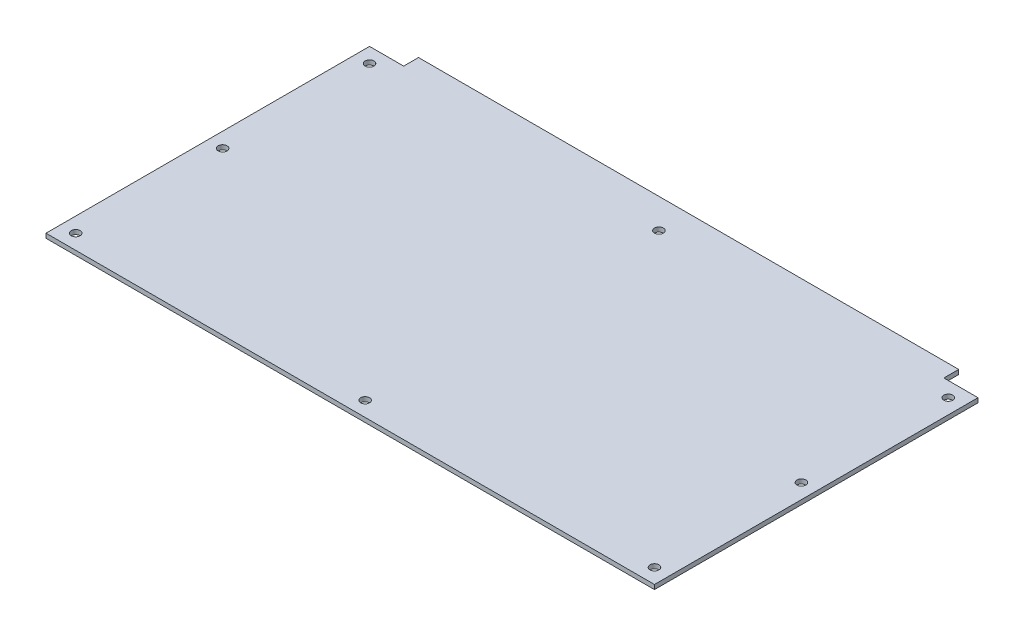
ISO-10303-21;
HEADER;
FILE_DESCRIPTION(('STEP AP214'),'2;1');
FILE_NAME('part.step','',(''),(''),'','','');
FILE_SCHEMA(('AUTOMOTIVE_DESIGN { 1 0 10303 214 1 1 1 1 }'));
ENDSEC;
DATA;
#1=APPLICATION_CONTEXT('core data for automotive mechanical design processes');
#2=APPLICATION_PROTOCOL_DEFINITION('international standard','automotive_design',2000,#1);
#3=PRODUCT_CONTEXT('',#1,'mechanical');
#4=PRODUCT('Part','Part','',(#3));
#5=PRODUCT_RELATED_PRODUCT_CATEGORY('part','',(#4));
#6=PRODUCT_DEFINITION_FORMATION('','',#4);
#7=PRODUCT_DEFINITION_CONTEXT('part definition',#1,'design');
#8=PRODUCT_DEFINITION('design','',#6,#7);
#9=PRODUCT_DEFINITION_SHAPE('','',#8);
#10=(LENGTH_UNIT() NAMED_UNIT(*) SI_UNIT(.MILLI.,.METRE.));
#11=(NAMED_UNIT(*) PLANE_ANGLE_UNIT() SI_UNIT($,.RADIAN.));
#12=(NAMED_UNIT(*) SI_UNIT($,.STERADIAN.) SOLID_ANGLE_UNIT());
#13=UNCERTAINTY_MEASURE_WITH_UNIT(LENGTH_MEASURE(1.E-05),#10,'distance_accuracy_value','');
#14=(GEOMETRIC_REPRESENTATION_CONTEXT(3) GLOBAL_UNCERTAINTY_ASSIGNED_CONTEXT((#13)) GLOBAL_UNIT_ASSIGNED_CONTEXT((#10,
#11,#12)) REPRESENTATION_CONTEXT('',''));
#15=CARTESIAN_POINT('',(0.,0.,0.));
#16=DIRECTION('',(0.,0.,1.));
#17=DIRECTION('',(1.,0.,0.));
#18=AXIS2_PLACEMENT_3D('',#15,#16,#17);
#19=CARTESIAN_POINT('',(0.,3.,0.));
#20=DIRECTION('',(0.,1.,0.));
#21=DIRECTION('',(0.,0.,1.));
#22=AXIS2_PLACEMENT_3D('',#19,#20,#21);
#23=PLANE('',#22);
#24=CARTESIAN_POINT('',(195.,3.,99.));
#25=DIRECTION('',(0.,1.,0.));
#26=DIRECTION('',(0.,0.,-1.));
#27=AXIS2_PLACEMENT_3D('',#24,#25,#26);
#28=CIRCLE('',#27,2.99999999999999);
#29=CARTESIAN_POINT('',(195.,3.,96.));
#30=VERTEX_POINT('',#29);
#31=EDGE_CURVE('E253',#30,#30,#28,.T.);
#32=ORIENTED_EDGE('',*,*,#31,.F.);
#33=EDGE_LOOP('',(#32));
#34=FACE_BOUND('',#33,.T.);
#35=CARTESIAN_POINT('',(195.,3.,-99.));
#36=DIRECTION('',(0.,1.,0.));
#37=DIRECTION('',(0.,0.,1.));
#38=AXIS2_PLACEMENT_3D('',#35,#36,#37);
#39=CIRCLE('',#38,2.99999999999999);
#40=CARTESIAN_POINT('',(195.,3.,-96.));
#41=VERTEX_POINT('',#40);
#42=EDGE_CURVE('E237',#41,#41,#39,.T.);
#43=ORIENTED_EDGE('',*,*,#42,.F.);
#44=EDGE_LOOP('',(#43));
#45=FACE_BOUND('',#44,.T.);
#46=CARTESIAN_POINT('',(-195.,3.,0.));
#47=DIRECTION('',(0.,1.,0.));
#48=DIRECTION('',(0.,0.,1.));
#49=AXIS2_PLACEMENT_3D('',#46,#47,#48);
#50=CIRCLE('',#49,2.99999999999999);
#51=CARTESIAN_POINT('',(-195.,3.,2.99999999999998));
#52=VERTEX_POINT('',#51);
#53=EDGE_CURVE('E221',#52,#52,#50,.T.);
#54=ORIENTED_EDGE('',*,*,#53,.F.);
#55=EDGE_LOOP('',(#54));
#56=FACE_BOUND('',#55,.T.);
#57=CARTESIAN_POINT('',(-195.,3.,99.));
#58=DIRECTION('',(0.,1.,0.));
#59=DIRECTION('',(0.,0.,1.));
#60=AXIS2_PLACEMENT_3D('',#57,#58,#59);
#61=CIRCLE('',#60,2.99999999999999);
#62=CARTESIAN_POINT('',(-195.,3.,102.));
#63=VERTEX_POINT('',#62);
#64=EDGE_CURVE('E146',#63,#63,#61,.T.);
#65=ORIENTED_EDGE('',*,*,#64,.F.);
#66=EDGE_LOOP('',(#65));
#67=FACE_BOUND('',#66,.T.);
#68=DIRECTION('',(0.,0.,-1.));
#69=VECTOR('',#68,1.);
#70=CARTESIAN_POINT('',(205.,3.,-109.));
#71=LINE('',#70,#69);
#72=CARTESIAN_POINT('',(205.,3.,109.));
#73=VERTEX_POINT('',#72);
#74=CARTESIAN_POINT('',(205.,3.,-109.));
#75=VERTEX_POINT('',#74);
#76=EDGE_CURVE('E164',#73,#75,#71,.T.);
#77=ORIENTED_EDGE('',*,*,#76,.T.);
#78=DIRECTION('',(-1.,0.,0.));
#79=VECTOR('',#78,1.);
#80=CARTESIAN_POINT('',(205.,3.,-109.));
#81=LINE('',#80,#79);
#82=CARTESIAN_POINT('',(182.,3.,-109.));
#83=VERTEX_POINT('',#82);
#84=EDGE_CURVE('E100',#75,#83,#81,.T.);
#85=ORIENTED_EDGE('',*,*,#84,.T.);
#86=DIRECTION('',(0.,0.,-1.));
#87=VECTOR('',#86,1.);
#88=CARTESIAN_POINT('',(182.,3.,-109.));
#89=LINE('',#88,#87);
#90=CARTESIAN_POINT('',(182.,3.,-119.));
#91=VERTEX_POINT('',#90);
#92=EDGE_CURVE('E185',#83,#91,#89,.T.);
#93=ORIENTED_EDGE('',*,*,#92,.T.);
#94=DIRECTION('',(-1.,0.,0.));
#95=VECTOR('',#94,1.);
#96=CARTESIAN_POINT('',(-182.,3.,-119.));
#97=LINE('',#96,#95);
#98=CARTESIAN_POINT('',(-182.,3.,-119.));
#99=VERTEX_POINT('',#98);
#100=EDGE_CURVE('E199',#91,#99,#97,.T.);
#101=ORIENTED_EDGE('',*,*,#100,.T.);
#102=DIRECTION('',(0.,0.,1.));
#103=VECTOR('',#102,1.);
#104=CARTESIAN_POINT('',(-182.,3.,-109.));
#105=LINE('',#104,#103);
#106=CARTESIAN_POINT('',(-182.,3.,-109.));
#107=VERTEX_POINT('',#106);
#108=EDGE_CURVE('E119',#99,#107,#105,.T.);
#109=ORIENTED_EDGE('',*,*,#108,.T.);
#110=DIRECTION('',(-1.,0.,0.));
#111=VECTOR('',#110,1.);
#112=CARTESIAN_POINT('',(-205.,3.,-109.));
#113=LINE('',#112,#111);
#114=CARTESIAN_POINT('',(-205.,3.,-109.));
#115=VERTEX_POINT('',#114);
#116=EDGE_CURVE('E113',#107,#115,#113,.T.);
#117=ORIENTED_EDGE('',*,*,#116,.T.);
#118=DIRECTION('',(0.,0.,1.));
#119=VECTOR('',#118,1.);
#120=CARTESIAN_POINT('',(-205.,3.,-109.));
#121=LINE('',#120,#119);
#122=CARTESIAN_POINT('',(-205.,3.,109.));
#123=VERTEX_POINT('',#122);
#124=EDGE_CURVE('E117',#115,#123,#121,.T.);
#125=ORIENTED_EDGE('',*,*,#124,.T.);
#126=DIRECTION('',(1.,0.,0.));
#127=VECTOR('',#126,1.);
#128=CARTESIAN_POINT('',(-205.,3.,109.));
#129=LINE('',#128,#127);
#130=EDGE_CURVE('E57',#123,#73,#129,.T.);
#131=ORIENTED_EDGE('',*,*,#130,.T.);
#132=EDGE_LOOP('',(#77,#85,#93,#101,#109,#117,#125,#131));
#133=FACE_BOUND('',#132,.T.);
#134=CARTESIAN_POINT('',(0.,3.,99.));
#135=DIRECTION('',(0.,1.,0.));
#136=DIRECTION('',(0.,0.,1.));
#137=AXIS2_PLACEMENT_3D('',#134,#135,#136);
#138=CIRCLE('',#137,3.);
#139=CARTESIAN_POINT('',(0.,3.,102.));
#140=VERTEX_POINT('',#139);
#141=EDGE_CURVE('E213',#140,#140,#138,.T.);
#142=ORIENTED_EDGE('',*,*,#141,.F.);
#143=EDGE_LOOP('',(#142));
#144=FACE_BOUND('',#143,.T.);
#145=CARTESIAN_POINT('',(-195.,3.,-99.));
#146=DIRECTION('',(0.,1.,0.));
#147=DIRECTION('',(0.,0.,-1.));
#148=AXIS2_PLACEMENT_3D('',#145,#146,#147);
#149=CIRCLE('',#148,2.99999999999999);
#150=CARTESIAN_POINT('',(-195.,3.,-102.));
#151=VERTEX_POINT('',#150);
#152=EDGE_CURVE('E229',#151,#151,#149,.T.);
#153=ORIENTED_EDGE('',*,*,#152,.F.);
#154=EDGE_LOOP('',(#153));
#155=FACE_BOUND('',#154,.T.);
#156=CARTESIAN_POINT('',(195.,3.,0.));
#157=DIRECTION('',(0.,1.,0.));
#158=DIRECTION('',(0.,0.,-1.));
#159=AXIS2_PLACEMENT_3D('',#156,#157,#158);
#160=CIRCLE('',#159,2.99999999999999);
#161=CARTESIAN_POINT('',(195.,3.,-3.00000000000001));
#162=VERTEX_POINT('',#161);
#163=EDGE_CURVE('E245',#162,#162,#160,.T.);
#164=ORIENTED_EDGE('',*,*,#163,.F.);
#165=EDGE_LOOP('',(#164));
#166=FACE_BOUND('',#165,.T.);
#167=CARTESIAN_POINT('',(0.,3.,-99.));
#168=DIRECTION('',(0.,1.,0.));
#169=DIRECTION('',(0.,0.,-1.));
#170=AXIS2_PLACEMENT_3D('',#167,#168,#169);
#171=CIRCLE('',#170,3.);
#172=CARTESIAN_POINT('',(0.,3.,-102.));
#173=VERTEX_POINT('',#172);
#174=EDGE_CURVE('E261',#173,#173,#171,.T.);
#175=ORIENTED_EDGE('',*,*,#174,.F.);
#176=EDGE_LOOP('',(#175));
#177=FACE_BOUND('',#176,.T.);
#178=ADVANCED_FACE('F39',(#34,#45,#56,#67,#133,#144,#155,#166,#177),#23,.T.);
#179=CARTESIAN_POINT('',(0.,0.,0.));
#180=DIRECTION('',(0.,1.,0.));
#181=DIRECTION('',(0.,0.,1.));
#182=AXIS2_PLACEMENT_3D('',#179,#180,#181);
#183=PLANE('',#182);
#184=DIRECTION('',(0.,0.,-1.));
#185=VECTOR('',#184,1.);
#186=CARTESIAN_POINT('',(205.,0.,-109.));
#187=LINE('',#186,#185);
#188=CARTESIAN_POINT('',(205.,0.,109.));
#189=VERTEX_POINT('',#188);
#190=CARTESIAN_POINT('',(205.,0.,-109.));
#191=VERTEX_POINT('',#190);
#192=EDGE_CURVE('E141',#189,#191,#187,.T.);
#193=ORIENTED_EDGE('',*,*,#192,.F.);
#194=DIRECTION('',(1.,0.,0.));
#195=VECTOR('',#194,1.);
#196=CARTESIAN_POINT('',(-205.,0.,109.));
#197=LINE('',#196,#195);
#198=CARTESIAN_POINT('',(-205.,0.,109.));
#199=VERTEX_POINT('',#198);
#200=EDGE_CURVE('E92',#199,#189,#197,.T.);
#201=ORIENTED_EDGE('',*,*,#200,.F.);
#202=DIRECTION('',(0.,0.,1.));
#203=VECTOR('',#202,1.);
#204=CARTESIAN_POINT('',(-205.,0.,-109.));
#205=LINE('',#204,#203);
#206=CARTESIAN_POINT('',(-205.,0.,-109.));
#207=VERTEX_POINT('',#206);
#208=EDGE_CURVE('E86',#207,#199,#205,.T.);
#209=ORIENTED_EDGE('',*,*,#208,.F.);
#210=DIRECTION('',(-1.,0.,0.));
#211=VECTOR('',#210,1.);
#212=CARTESIAN_POINT('',(-205.,0.,-109.));
#213=LINE('',#212,#211);
#214=CARTESIAN_POINT('',(-182.,0.,-109.));
#215=VERTEX_POINT('',#214);
#216=EDGE_CURVE('E128',#215,#207,#213,.T.);
#217=ORIENTED_EDGE('',*,*,#216,.F.);
#218=DIRECTION('',(0.,0.,1.));
#219=VECTOR('',#218,1.);
#220=CARTESIAN_POINT('',(-182.,0.,-109.));
#221=LINE('',#220,#219);
#222=CARTESIAN_POINT('',(-182.,0.,-119.));
#223=VERTEX_POINT('',#222);
#224=EDGE_CURVE('E155',#223,#215,#221,.T.);
#225=ORIENTED_EDGE('',*,*,#224,.F.);
#226=DIRECTION('',(-1.,0.,0.));
#227=VECTOR('',#226,1.);
#228=CARTESIAN_POINT('',(-182.,0.,-119.));
#229=LINE('',#228,#227);
#230=CARTESIAN_POINT('',(182.,0.,-119.));
#231=VERTEX_POINT('',#230);
#232=EDGE_CURVE('E152',#231,#223,#229,.T.);
#233=ORIENTED_EDGE('',*,*,#232,.F.);
#234=DIRECTION('',(0.,0.,-1.));
#235=VECTOR('',#234,1.);
#236=CARTESIAN_POINT('',(182.,0.,-109.));
#237=LINE('',#236,#235);
#238=CARTESIAN_POINT('',(182.,0.,-109.));
#239=VERTEX_POINT('',#238);
#240=EDGE_CURVE('E149',#239,#231,#237,.T.);
#241=ORIENTED_EDGE('',*,*,#240,.F.);
#242=DIRECTION('',(-1.,0.,0.));
#243=VECTOR('',#242,1.);
#244=CARTESIAN_POINT('',(205.,0.,-109.));
#245=LINE('',#244,#243);
#246=EDGE_CURVE('E145',#191,#239,#245,.T.);
#247=ORIENTED_EDGE('',*,*,#246,.F.);
#248=EDGE_LOOP('',(#193,#201,#209,#217,#225,#233,#241,#247));
#249=FACE_BOUND('',#248,.T.);
#250=CARTESIAN_POINT('',(-195.,0.,99.));
#251=DIRECTION('',(0.,1.,0.));
#252=DIRECTION('',(0.,0.,1.));
#253=AXIS2_PLACEMENT_3D('',#250,#251,#252);
#254=CIRCLE('',#253,2.99999999999999);
#255=CARTESIAN_POINT('',(-195.,0.,102.));
#256=VERTEX_POINT('',#255);
#257=EDGE_CURVE('E209',#256,#256,#254,.T.);
#258=ORIENTED_EDGE('',*,*,#257,.T.);
#259=EDGE_LOOP('',(#258));
#260=FACE_BOUND('',#259,.T.);
#261=CARTESIAN_POINT('',(0.,0.,99.));
#262=DIRECTION('',(0.,1.,0.));
#263=DIRECTION('',(0.,0.,1.));
#264=AXIS2_PLACEMENT_3D('',#261,#262,#263);
#265=CIRCLE('',#264,3.);
#266=CARTESIAN_POINT('',(0.,0.,102.));
#267=VERTEX_POINT('',#266);
#268=EDGE_CURVE('E217',#267,#267,#265,.T.);
#269=ORIENTED_EDGE('',*,*,#268,.T.);
#270=EDGE_LOOP('',(#269));
#271=FACE_BOUND('',#270,.T.);
#272=CARTESIAN_POINT('',(-195.,0.,0.));
#273=DIRECTION('',(0.,1.,0.));
#274=DIRECTION('',(0.,0.,1.));
#275=AXIS2_PLACEMENT_3D('',#272,#273,#274);
#276=CIRCLE('',#275,2.99999999999999);
#277=CARTESIAN_POINT('',(-195.,0.,2.99999999999998));
#278=VERTEX_POINT('',#277);
#279=EDGE_CURVE('E225',#278,#278,#276,.T.);
#280=ORIENTED_EDGE('',*,*,#279,.T.);
#281=EDGE_LOOP('',(#280));
#282=FACE_BOUND('',#281,.T.);
#283=CARTESIAN_POINT('',(-195.,0.,-99.));
#284=DIRECTION('',(0.,1.,0.));
#285=DIRECTION('',(0.,0.,-1.));
#286=AXIS2_PLACEMENT_3D('',#283,#284,#285);
#287=CIRCLE('',#286,2.99999999999999);
#288=CARTESIAN_POINT('',(-195.,0.,-102.));
#289=VERTEX_POINT('',#288);
#290=EDGE_CURVE('E233',#289,#289,#287,.T.);
#291=ORIENTED_EDGE('',*,*,#290,.T.);
#292=EDGE_LOOP('',(#291));
#293=FACE_BOUND('',#292,.T.);
#294=CARTESIAN_POINT('',(195.,0.,-99.));
#295=DIRECTION('',(0.,1.,0.));
#296=DIRECTION('',(0.,0.,1.));
#297=AXIS2_PLACEMENT_3D('',#294,#295,#296);
#298=CIRCLE('',#297,2.99999999999999);
#299=CARTESIAN_POINT('',(195.,0.,-96.));
#300=VERTEX_POINT('',#299);
#301=EDGE_CURVE('E241',#300,#300,#298,.T.);
#302=ORIENTED_EDGE('',*,*,#301,.T.);
#303=EDGE_LOOP('',(#302));
#304=FACE_BOUND('',#303,.T.);
#305=CARTESIAN_POINT('',(195.,0.,0.));
#306=DIRECTION('',(0.,1.,0.));
#307=DIRECTION('',(0.,0.,-1.));
#308=AXIS2_PLACEMENT_3D('',#305,#306,#307);
#309=CIRCLE('',#308,2.99999999999999);
#310=CARTESIAN_POINT('',(195.,0.,-3.00000000000001));
#311=VERTEX_POINT('',#310);
#312=EDGE_CURVE('E249',#311,#311,#309,.T.);
#313=ORIENTED_EDGE('',*,*,#312,.T.);
#314=EDGE_LOOP('',(#313));
#315=FACE_BOUND('',#314,.T.);
#316=CARTESIAN_POINT('',(195.,0.,99.));
#317=DIRECTION('',(0.,1.,0.));
#318=DIRECTION('',(0.,0.,-1.));
#319=AXIS2_PLACEMENT_3D('',#316,#317,#318);
#320=CIRCLE('',#319,2.99999999999999);
#321=CARTESIAN_POINT('',(195.,0.,96.));
#322=VERTEX_POINT('',#321);
#323=EDGE_CURVE('E257',#322,#322,#320,.T.);
#324=ORIENTED_EDGE('',*,*,#323,.T.);
#325=EDGE_LOOP('',(#324));
#326=FACE_BOUND('',#325,.T.);
#327=CARTESIAN_POINT('',(0.,0.,-99.));
#328=DIRECTION('',(0.,1.,0.));
#329=DIRECTION('',(0.,0.,-1.));
#330=AXIS2_PLACEMENT_3D('',#327,#328,#329);
#331=CIRCLE('',#330,3.);
#332=CARTESIAN_POINT('',(0.,0.,-102.));
#333=VERTEX_POINT('',#332);
#334=EDGE_CURVE('E265',#333,#333,#331,.T.);
#335=ORIENTED_EDGE('',*,*,#334,.T.);
#336=EDGE_LOOP('',(#335));
#337=FACE_BOUND('',#336,.T.);
#338=ADVANCED_FACE('F189',(#249,#260,#271,#282,#293,#304,#315,#326,#337),#183,.F.);
#339=CARTESIAN_POINT('',(205.,3.,-109.));
#340=DIRECTION('',(-1.,0.,0.));
#341=DIRECTION('',(0.,0.,1.));
#342=AXIS2_PLACEMENT_3D('',#339,#340,#341);
#343=PLANE('',#342);
#344=ORIENTED_EDGE('',*,*,#192,.T.);
#345=DIRECTION('',(0.,-1.,0.));
#346=VECTOR('',#345,1.);
#347=CARTESIAN_POINT('',(205.,3.,-109.));
#348=LINE('',#347,#346);
#349=EDGE_CURVE('E11',#75,#191,#348,.T.);
#350=ORIENTED_EDGE('',*,*,#349,.F.);
#351=ORIENTED_EDGE('',*,*,#76,.F.);
#352=DIRECTION('',(0.,-1.,0.));
#353=VECTOR('',#352,1.);
#354=CARTESIAN_POINT('',(205.,3.,109.));
#355=LINE('',#354,#353);
#356=EDGE_CURVE('E137',#73,#189,#355,.T.);
#357=ORIENTED_EDGE('',*,*,#356,.T.);
#358=EDGE_LOOP('',(#344,#350,#351,#357));
#359=FACE_BOUND('',#358,.T.);
#360=ADVANCED_FACE('F41',(#359),#343,.F.);
#361=CARTESIAN_POINT('',(205.,3.,-109.));
#362=DIRECTION('',(0.,0.,1.));
#363=DIRECTION('',(1.,0.,0.));
#364=AXIS2_PLACEMENT_3D('',#361,#362,#363);
#365=PLANE('',#364);
#366=ORIENTED_EDGE('',*,*,#246,.T.);
#367=DIRECTION('',(0.,-1.,0.));
#368=VECTOR('',#367,1.);
#369=CARTESIAN_POINT('',(182.,3.,-109.));
#370=LINE('',#369,#368);
#371=EDGE_CURVE('E49',#83,#239,#370,.T.);
#372=ORIENTED_EDGE('',*,*,#371,.F.);
#373=ORIENTED_EDGE('',*,*,#84,.F.);
#374=ORIENTED_EDGE('',*,*,#349,.T.);
#375=EDGE_LOOP('',(#366,#372,#373,#374));
#376=FACE_BOUND('',#375,.T.);
#377=ADVANCED_FACE('F301',(#376),#365,.F.);
#378=CARTESIAN_POINT('',(182.,3.,-109.));
#379=DIRECTION('',(-1.,0.,0.));
#380=DIRECTION('',(0.,0.,1.));
#381=AXIS2_PLACEMENT_3D('',#378,#379,#380);
#382=PLANE('',#381);
#383=ORIENTED_EDGE('',*,*,#240,.T.);
#384=DIRECTION('',(0.,-1.,0.));
#385=VECTOR('',#384,1.);
#386=CARTESIAN_POINT('',(182.,3.,-119.));
#387=LINE('',#386,#385);
#388=EDGE_CURVE('E175',#91,#231,#387,.T.);
#389=ORIENTED_EDGE('',*,*,#388,.F.);
#390=ORIENTED_EDGE('',*,*,#92,.F.);
#391=ORIENTED_EDGE('',*,*,#371,.T.);
#392=EDGE_LOOP('',(#383,#389,#390,#391));
#393=FACE_BOUND('',#392,.T.);
#394=ADVANCED_FACE('F183',(#393),#382,.F.);
#395=CARTESIAN_POINT('',(-182.,3.,-119.));
#396=DIRECTION('',(0.,0.,1.));
#397=DIRECTION('',(1.,0.,0.));
#398=AXIS2_PLACEMENT_3D('',#395,#396,#397);
#399=PLANE('',#398);
#400=ORIENTED_EDGE('',*,*,#232,.T.);
#401=DIRECTION('',(0.,-1.,0.));
#402=VECTOR('',#401,1.);
#403=CARTESIAN_POINT('',(-182.,3.,-119.));
#404=LINE('',#403,#402);
#405=EDGE_CURVE('E171',#99,#223,#404,.T.);
#406=ORIENTED_EDGE('',*,*,#405,.F.);
#407=ORIENTED_EDGE('',*,*,#100,.F.);
#408=ORIENTED_EDGE('',*,*,#388,.T.);
#409=EDGE_LOOP('',(#400,#406,#407,#408));
#410=FACE_BOUND('',#409,.T.);
#411=ADVANCED_FACE('F194',(#410),#399,.F.);
#412=CARTESIAN_POINT('',(-182.,3.,-109.));
#413=DIRECTION('',(1.,0.,0.));
#414=DIRECTION('',(0.,0.,-1.));
#415=AXIS2_PLACEMENT_3D('',#412,#413,#414);
#416=PLANE('',#415);
#417=ORIENTED_EDGE('',*,*,#224,.T.);
#418=DIRECTION('',(0.,-1.,0.));
#419=VECTOR('',#418,1.);
#420=CARTESIAN_POINT('',(-182.,3.,-109.));
#421=LINE('',#420,#419);
#422=EDGE_CURVE('E130',#107,#215,#421,.T.);
#423=ORIENTED_EDGE('',*,*,#422,.F.);
#424=ORIENTED_EDGE('',*,*,#108,.F.);
#425=ORIENTED_EDGE('',*,*,#405,.T.);
#426=EDGE_LOOP('',(#417,#423,#424,#425));
#427=FACE_BOUND('',#426,.T.);
#428=ADVANCED_FACE('F197',(#427),#416,.F.);
#429=CARTESIAN_POINT('',(-205.,3.,-109.));
#430=DIRECTION('',(0.,0.,1.));
#431=DIRECTION('',(1.,0.,0.));
#432=AXIS2_PLACEMENT_3D('',#429,#430,#431);
#433=PLANE('',#432);
#434=ORIENTED_EDGE('',*,*,#216,.T.);
#435=DIRECTION('',(0.,-1.,0.));
#436=VECTOR('',#435,1.);
#437=CARTESIAN_POINT('',(-205.,3.,-109.));
#438=LINE('',#437,#436);
#439=EDGE_CURVE('E125',#115,#207,#438,.T.);
#440=ORIENTED_EDGE('',*,*,#439,.F.);
#441=ORIENTED_EDGE('',*,*,#116,.F.);
#442=ORIENTED_EDGE('',*,*,#422,.T.);
#443=EDGE_LOOP('',(#434,#440,#441,#442));
#444=FACE_BOUND('',#443,.T.);
#445=ADVANCED_FACE('F126',(#444),#433,.F.);
#446=CARTESIAN_POINT('',(-205.,3.,-109.));
#447=DIRECTION('',(1.,0.,0.));
#448=DIRECTION('',(0.,0.,-1.));
#449=AXIS2_PLACEMENT_3D('',#446,#447,#448);
#450=PLANE('',#449);
#451=ORIENTED_EDGE('',*,*,#208,.T.);
#452=DIRECTION('',(0.,-1.,0.));
#453=VECTOR('',#452,1.);
#454=CARTESIAN_POINT('',(-205.,3.,109.));
#455=LINE('',#454,#453);
#456=EDGE_CURVE('E131',#123,#199,#455,.T.);
#457=ORIENTED_EDGE('',*,*,#456,.F.);
#458=ORIENTED_EDGE('',*,*,#124,.F.);
#459=ORIENTED_EDGE('',*,*,#439,.T.);
#460=EDGE_LOOP('',(#451,#457,#458,#459));
#461=FACE_BOUND('',#460,.T.);
#462=ADVANCED_FACE('F133',(#461),#450,.F.);
#463=CARTESIAN_POINT('',(-205.,3.,109.));
#464=DIRECTION('',(0.,0.,-1.));
#465=DIRECTION('',(-1.,0.,0.));
#466=AXIS2_PLACEMENT_3D('',#463,#464,#465);
#467=PLANE('',#466);
#468=ORIENTED_EDGE('',*,*,#200,.T.);
#469=ORIENTED_EDGE('',*,*,#356,.F.);
#470=ORIENTED_EDGE('',*,*,#130,.F.);
#471=ORIENTED_EDGE('',*,*,#456,.T.);
#472=EDGE_LOOP('',(#468,#469,#470,#471));
#473=FACE_BOUND('',#472,.T.);
#474=ADVANCED_FACE('F289',(#473),#467,.F.);
#475=CARTESIAN_POINT('',(-195.,3.,99.));
#476=DIRECTION('',(0.,-1.,0.));
#477=DIRECTION('',(0.,0.,-1.));
#478=AXIS2_PLACEMENT_3D('',#475,#476,#477);
#479=CYLINDRICAL_SURFACE('',#478,2.99999999999999);
#480=ORIENTED_EDGE('',*,*,#64,.T.);
#481=EDGE_LOOP('',(#480));
#482=FACE_BOUND('',#481,.T.);
#483=ORIENTED_EDGE('',*,*,#257,.F.);
#484=EDGE_LOOP('',(#483));
#485=FACE_BOUND('',#484,.T.);
#486=ADVANCED_FACE('F286',(#482,#485),#479,.F.);
#487=CARTESIAN_POINT('',(0.,3.,99.));
#488=DIRECTION('',(0.,-1.,0.));
#489=DIRECTION('',(0.,0.,-1.));
#490=AXIS2_PLACEMENT_3D('',#487,#488,#489);
#491=CYLINDRICAL_SURFACE('',#490,3.);
#492=ORIENTED_EDGE('',*,*,#141,.T.);
#493=EDGE_LOOP('',(#492));
#494=FACE_BOUND('',#493,.T.);
#495=ORIENTED_EDGE('',*,*,#268,.F.);
#496=EDGE_LOOP('',(#495));
#497=FACE_BOUND('',#496,.T.);
#498=ADVANCED_FACE('F365',(#494,#497),#491,.F.);
#499=CARTESIAN_POINT('',(-195.,3.,0.));
#500=DIRECTION('',(0.,-1.,0.));
#501=DIRECTION('',(0.,0.,-1.));
#502=AXIS2_PLACEMENT_3D('',#499,#500,#501);
#503=CYLINDRICAL_SURFACE('',#502,2.99999999999999);
#504=ORIENTED_EDGE('',*,*,#53,.T.);
#505=EDGE_LOOP('',(#504));
#506=FACE_BOUND('',#505,.T.);
#507=ORIENTED_EDGE('',*,*,#279,.F.);
#508=EDGE_LOOP('',(#507));
#509=FACE_BOUND('',#508,.T.);
#510=ADVANCED_FACE('F373',(#506,#509),#503,.F.);
#511=CARTESIAN_POINT('',(-195.,3.,-99.));
#512=DIRECTION('',(0.,-1.,0.));
#513=DIRECTION('',(0.,0.,-1.));
#514=AXIS2_PLACEMENT_3D('',#511,#512,#513);
#515=CYLINDRICAL_SURFACE('',#514,2.99999999999999);
#516=ORIENTED_EDGE('',*,*,#152,.T.);
#517=EDGE_LOOP('',(#516));
#518=FACE_BOUND('',#517,.T.);
#519=ORIENTED_EDGE('',*,*,#290,.F.);
#520=EDGE_LOOP('',(#519));
#521=FACE_BOUND('',#520,.T.);
#522=ADVANCED_FACE('F381',(#518,#521),#515,.F.);
#523=CARTESIAN_POINT('',(195.,3.,-99.));
#524=DIRECTION('',(0.,-1.,0.));
#525=DIRECTION('',(0.,0.,-1.));
#526=AXIS2_PLACEMENT_3D('',#523,#524,#525);
#527=CYLINDRICAL_SURFACE('',#526,2.99999999999999);
#528=ORIENTED_EDGE('',*,*,#42,.T.);
#529=EDGE_LOOP('',(#528));
#530=FACE_BOUND('',#529,.T.);
#531=ORIENTED_EDGE('',*,*,#301,.F.);
#532=EDGE_LOOP('',(#531));
#533=FACE_BOUND('',#532,.T.);
#534=ADVANCED_FACE('F390',(#530,#533),#527,.F.);
#535=CARTESIAN_POINT('',(195.,3.,0.));
#536=DIRECTION('',(0.,-1.,0.));
#537=DIRECTION('',(0.,0.,-1.));
#538=AXIS2_PLACEMENT_3D('',#535,#536,#537);
#539=CYLINDRICAL_SURFACE('',#538,2.99999999999999);
#540=ORIENTED_EDGE('',*,*,#163,.T.);
#541=EDGE_LOOP('',(#540));
#542=FACE_BOUND('',#541,.T.);
#543=ORIENTED_EDGE('',*,*,#312,.F.);
#544=EDGE_LOOP('',(#543));
#545=FACE_BOUND('',#544,.T.);
#546=ADVANCED_FACE('F399',(#542,#545),#539,.F.);
#547=CARTESIAN_POINT('',(195.,3.,99.));
#548=DIRECTION('',(0.,-1.,0.));
#549=DIRECTION('',(0.,0.,-1.));
#550=AXIS2_PLACEMENT_3D('',#547,#548,#549);
#551=CYLINDRICAL_SURFACE('',#550,2.99999999999999);
#552=ORIENTED_EDGE('',*,*,#31,.T.);
#553=EDGE_LOOP('',(#552));
#554=FACE_BOUND('',#553,.T.);
#555=ORIENTED_EDGE('',*,*,#323,.F.);
#556=EDGE_LOOP('',(#555));
#557=FACE_BOUND('',#556,.T.);
#558=ADVANCED_FACE('F408',(#554,#557),#551,.F.);
#559=CARTESIAN_POINT('',(0.,3.,-99.));
#560=DIRECTION('',(0.,-1.,0.));
#561=DIRECTION('',(0.,0.,-1.));
#562=AXIS2_PLACEMENT_3D('',#559,#560,#561);
#563=CYLINDRICAL_SURFACE('',#562,3.);
#564=ORIENTED_EDGE('',*,*,#174,.T.);
#565=EDGE_LOOP('',(#564));
#566=FACE_BOUND('',#565,.T.);
#567=ORIENTED_EDGE('',*,*,#334,.F.);
#568=EDGE_LOOP('',(#567));
#569=FACE_BOUND('',#568,.T.);
#570=ADVANCED_FACE('F273',(#566,#569),#563,.F.);
#571=CLOSED_SHELL('',(#178,#338,#360,#377,#394,#411,#428,#445,#462,#474,#486,#498,#510,#522,
#534,#546,#558,#570));
#572=MANIFOLD_SOLID_BREP('B2',#571);
#573=ADVANCED_BREP_SHAPE_REPRESENTATION('',(#18,#572),#14);
#574=SHAPE_DEFINITION_REPRESENTATION(#9,#573);
ENDSEC;
END-ISO-10303-21;
